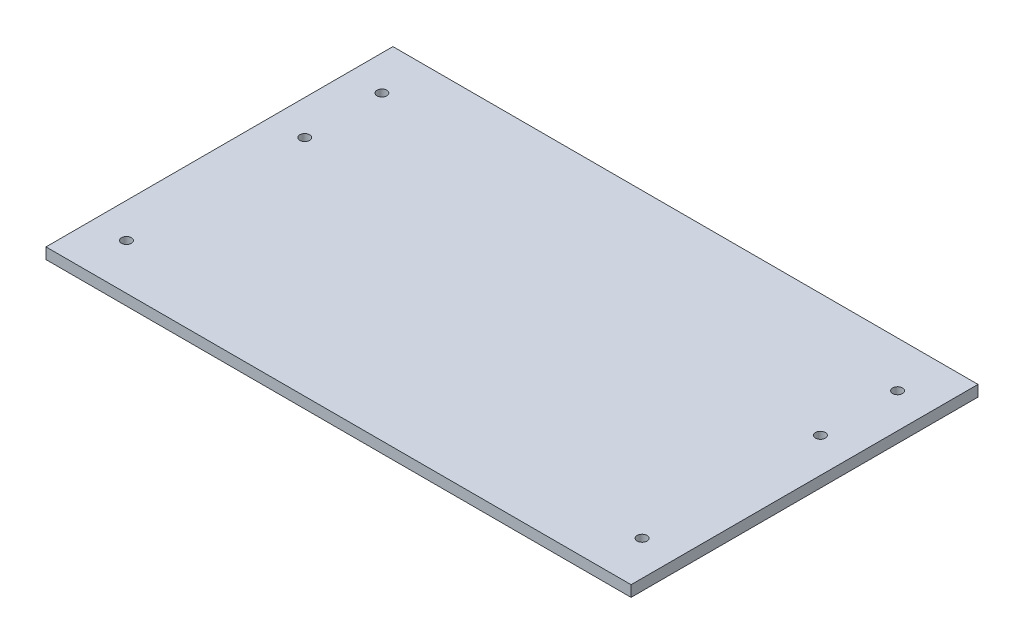
ISO-10303-21;
HEADER;
FILE_DESCRIPTION(('STEP AP214'),'2;1');
FILE_NAME('part.step','',(''),(''),'','','');
FILE_SCHEMA(('AUTOMOTIVE_DESIGN { 1 0 10303 214 1 1 1 1 }'));
ENDSEC;
DATA;
#1=APPLICATION_CONTEXT('core data for automotive mechanical design processes');
#2=APPLICATION_PROTOCOL_DEFINITION('international standard','automotive_design',2000,#1);
#3=PRODUCT_CONTEXT('',#1,'mechanical');
#4=PRODUCT('Part','Part','',(#3));
#5=PRODUCT_RELATED_PRODUCT_CATEGORY('part','',(#4));
#6=PRODUCT_DEFINITION_FORMATION('','',#4);
#7=PRODUCT_DEFINITION_CONTEXT('part definition',#1,'design');
#8=PRODUCT_DEFINITION('design','',#6,#7);
#9=PRODUCT_DEFINITION_SHAPE('','',#8);
#10=(LENGTH_UNIT() NAMED_UNIT(*) SI_UNIT(.MILLI.,.METRE.));
#11=(NAMED_UNIT(*) PLANE_ANGLE_UNIT() SI_UNIT($,.RADIAN.));
#12=(NAMED_UNIT(*) SI_UNIT($,.STERADIAN.) SOLID_ANGLE_UNIT());
#13=UNCERTAINTY_MEASURE_WITH_UNIT(LENGTH_MEASURE(1.E-05),#10,'distance_accuracy_value','');
#14=(GEOMETRIC_REPRESENTATION_CONTEXT(3) GLOBAL_UNCERTAINTY_ASSIGNED_CONTEXT((#13)) GLOBAL_UNIT_ASSIGNED_CONTEXT((#10,
#11,#12)) REPRESENTATION_CONTEXT('',''));
#15=CARTESIAN_POINT('',(0.,0.,0.));
#16=DIRECTION('',(0.,0.,1.));
#17=DIRECTION('',(1.,0.,0.));
#18=AXIS2_PLACEMENT_3D('',#15,#16,#17);
#19=CARTESIAN_POINT('',(84.325,3.18,50.));
#20=DIRECTION('',(-1.,0.,0.));
#21=DIRECTION('',(0.,0.,1.));
#22=AXIS2_PLACEMENT_3D('',#19,#20,#21);
#23=PLANE('',#22);
#24=DIRECTION('',(0.,0.,-1.));
#25=VECTOR('',#24,1.);
#26=CARTESIAN_POINT('',(84.325,0.,50.));
#27=LINE('',#26,#25);
#28=CARTESIAN_POINT('',(84.325,0.,50.));
#29=VERTEX_POINT('',#28);
#30=CARTESIAN_POINT('',(84.325,0.,-50.));
#31=VERTEX_POINT('',#30);
#32=EDGE_CURVE('E97',#29,#31,#27,.T.);
#33=ORIENTED_EDGE('',*,*,#32,.T.);
#34=DIRECTION('',(0.,-1.,0.));
#35=VECTOR('',#34,1.);
#36=CARTESIAN_POINT('',(84.325,3.18,-50.));
#37=LINE('',#36,#35);
#38=CARTESIAN_POINT('',(84.325,3.18,-50.));
#39=VERTEX_POINT('',#38);
#40=EDGE_CURVE('E11',#39,#31,#37,.T.);
#41=ORIENTED_EDGE('',*,*,#40,.F.);
#42=DIRECTION('',(0.,0.,-1.));
#43=VECTOR('',#42,1.);
#44=CARTESIAN_POINT('',(84.325,3.18,50.));
#45=LINE('',#44,#43);
#46=CARTESIAN_POINT('',(84.325,3.18,50.));
#47=VERTEX_POINT('',#46);
#48=EDGE_CURVE('E85',#47,#39,#45,.T.);
#49=ORIENTED_EDGE('',*,*,#48,.F.);
#50=DIRECTION('',(0.,-1.,0.));
#51=VECTOR('',#50,1.);
#52=CARTESIAN_POINT('',(84.325,3.18,50.));
#53=LINE('',#52,#51);
#54=EDGE_CURVE('E93',#47,#29,#53,.T.);
#55=ORIENTED_EDGE('',*,*,#54,.T.);
#56=EDGE_LOOP('',(#33,#41,#49,#55));
#57=FACE_BOUND('',#56,.T.);
#58=ADVANCED_FACE('F34',(#57),#23,.F.);
#59=CARTESIAN_POINT('',(-84.325,3.18,-50.));
#60=DIRECTION('',(0.,0.,1.));
#61=DIRECTION('',(1.,0.,0.));
#62=AXIS2_PLACEMENT_3D('',#59,#60,#61);
#63=PLANE('',#62);
#64=DIRECTION('',(-1.,0.,0.));
#65=VECTOR('',#64,1.);
#66=CARTESIAN_POINT('',(-84.325,0.,-50.));
#67=LINE('',#66,#65);
#68=CARTESIAN_POINT('',(-84.325,0.,-50.));
#69=VERTEX_POINT('',#68);
#70=EDGE_CURVE('E89',#31,#69,#67,.T.);
#71=ORIENTED_EDGE('',*,*,#70,.T.);
#72=DIRECTION('',(0.,-1.,0.));
#73=VECTOR('',#72,1.);
#74=CARTESIAN_POINT('',(-84.325,3.18,-50.));
#75=LINE('',#74,#73);
#76=CARTESIAN_POINT('',(-84.325,3.18,-50.));
#77=VERTEX_POINT('',#76);
#78=EDGE_CURVE('E42',#77,#69,#75,.T.);
#79=ORIENTED_EDGE('',*,*,#78,.F.);
#80=DIRECTION('',(-1.,0.,0.));
#81=VECTOR('',#80,1.);
#82=CARTESIAN_POINT('',(-84.325,3.18,-50.));
#83=LINE('',#82,#81);
#84=EDGE_CURVE('E80',#39,#77,#83,.T.);
#85=ORIENTED_EDGE('',*,*,#84,.F.);
#86=ORIENTED_EDGE('',*,*,#40,.T.);
#87=EDGE_LOOP('',(#71,#79,#85,#86));
#88=FACE_BOUND('',#87,.T.);
#89=ADVANCED_FACE('F88',(#88),#63,.F.);
#90=CARTESIAN_POINT('',(-84.325,3.18,50.));
#91=DIRECTION('',(1.,0.,0.));
#92=DIRECTION('',(0.,0.,-1.));
#93=AXIS2_PLACEMENT_3D('',#90,#91,#92);
#94=PLANE('',#93);
#95=DIRECTION('',(0.,0.,1.));
#96=VECTOR('',#95,1.);
#97=CARTESIAN_POINT('',(-84.325,0.,50.));
#98=LINE('',#97,#96);
#99=CARTESIAN_POINT('',(-84.325,0.,50.));
#100=VERTEX_POINT('',#99);
#101=EDGE_CURVE('E67',#69,#100,#98,.T.);
#102=ORIENTED_EDGE('',*,*,#101,.T.);
#103=DIRECTION('',(0.,-1.,0.));
#104=VECTOR('',#103,1.);
#105=CARTESIAN_POINT('',(-84.325,3.18,50.));
#106=LINE('',#105,#104);
#107=CARTESIAN_POINT('',(-84.325,3.18,50.));
#108=VERTEX_POINT('',#107);
#109=EDGE_CURVE('E90',#108,#100,#106,.T.);
#110=ORIENTED_EDGE('',*,*,#109,.F.);
#111=DIRECTION('',(0.,0.,1.));
#112=VECTOR('',#111,1.);
#113=CARTESIAN_POINT('',(-84.325,3.18,50.));
#114=LINE('',#113,#112);
#115=EDGE_CURVE('E83',#77,#108,#114,.T.);
#116=ORIENTED_EDGE('',*,*,#115,.F.);
#117=ORIENTED_EDGE('',*,*,#78,.T.);
#118=EDGE_LOOP('',(#102,#110,#116,#117));
#119=FACE_BOUND('',#118,.T.);
#120=ADVANCED_FACE('F91',(#119),#94,.F.);
#121=CARTESIAN_POINT('',(-84.325,3.18,50.));
#122=DIRECTION('',(0.,0.,-1.));
#123=DIRECTION('',(-1.,0.,0.));
#124=AXIS2_PLACEMENT_3D('',#121,#122,#123);
#125=PLANE('',#124);
#126=DIRECTION('',(1.,0.,0.));
#127=VECTOR('',#126,1.);
#128=CARTESIAN_POINT('',(-84.325,0.,50.));
#129=LINE('',#128,#127);
#130=EDGE_CURVE('E73',#100,#29,#129,.T.);
#131=ORIENTED_EDGE('',*,*,#130,.T.);
#132=ORIENTED_EDGE('',*,*,#54,.F.);
#133=DIRECTION('',(1.,0.,0.));
#134=VECTOR('',#133,1.);
#135=CARTESIAN_POINT('',(-84.325,3.18,50.));
#136=LINE('',#135,#134);
#137=EDGE_CURVE('E50',#108,#47,#136,.T.);
#138=ORIENTED_EDGE('',*,*,#137,.F.);
#139=ORIENTED_EDGE('',*,*,#109,.T.);
#140=EDGE_LOOP('',(#131,#132,#138,#139));
#141=FACE_BOUND('',#140,.T.);
#142=ADVANCED_FACE('F105',(#141),#125,.F.);
#143=CARTESIAN_POINT('',(0.,3.18,0.));
#144=DIRECTION('',(0.,-1.,0.));
#145=DIRECTION('',(0.,0.,-1.));
#146=AXIS2_PLACEMENT_3D('',#143,#144,#145);
#147=PLANE('',#146);
#148=CARTESIAN_POINT('',(-74.325,3.18,-14.58));
#149=DIRECTION('',(0.,1.,0.));
#150=DIRECTION('',(0.,0.,1.));
#151=AXIS2_PLACEMENT_3D('',#148,#149,#150);
#152=CIRCLE('',#151,1.42240000000001);
#153=CARTESIAN_POINT('',(-74.325,3.18,-13.1576));
#154=VERTEX_POINT('',#153);
#155=EDGE_CURVE('E141',#154,#154,#152,.T.);
#156=ORIENTED_EDGE('',*,*,#155,.F.);
#157=EDGE_LOOP('',(#156));
#158=FACE_BOUND('',#157,.T.);
#159=CARTESIAN_POINT('',(74.325,3.18,-14.58));
#160=DIRECTION('',(0.,1.,0.));
#161=DIRECTION('',(0.,0.,1.));
#162=AXIS2_PLACEMENT_3D('',#159,#160,#161);
#163=CIRCLE('',#162,1.42239999999999);
#164=CARTESIAN_POINT('',(74.325,3.18,-13.1576));
#165=VERTEX_POINT('',#164);
#166=EDGE_CURVE('E135',#165,#165,#163,.T.);
#167=ORIENTED_EDGE('',*,*,#166,.F.);
#168=EDGE_LOOP('',(#167));
#169=FACE_BOUND('',#168,.T.);
#170=CARTESIAN_POINT('',(-74.325,3.18,-36.82));
#171=DIRECTION('',(0.,1.,0.));
#172=DIRECTION('',(0.,0.,1.));
#173=AXIS2_PLACEMENT_3D('',#170,#171,#172);
#174=CIRCLE('',#173,1.42239999999999);
#175=CARTESIAN_POINT('',(-74.325,3.18,-38.2424));
#176=VERTEX_POINT('',#175);
#177=EDGE_CURVE('E115',#176,#176,#174,.T.);
#178=ORIENTED_EDGE('',*,*,#177,.F.);
#179=EDGE_LOOP('',(#178));
#180=FACE_BOUND('',#179,.T.);
#181=CARTESIAN_POINT('',(74.325,3.18,-36.82));
#182=DIRECTION('',(0.,1.,0.));
#183=DIRECTION('',(0.,0.,1.));
#184=AXIS2_PLACEMENT_3D('',#181,#182,#183);
#185=CIRCLE('',#184,1.42240000000001);
#186=CARTESIAN_POINT('',(74.325,3.18,-38.2424));
#187=VERTEX_POINT('',#186);
#188=EDGE_CURVE('E126',#187,#187,#185,.T.);
#189=ORIENTED_EDGE('',*,*,#188,.F.);
#190=EDGE_LOOP('',(#189));
#191=FACE_BOUND('',#190,.T.);
#192=CARTESIAN_POINT('',(-74.325,3.18,36.82));
#193=DIRECTION('',(0.,-1.,0.));
#194=DIRECTION('',(0.,0.,-1.));
#195=AXIS2_PLACEMENT_3D('',#192,#193,#194);
#196=CIRCLE('',#195,1.42239999999999);
#197=CARTESIAN_POINT('',(-74.325,3.18,35.3976));
#198=VERTEX_POINT('',#197);
#199=EDGE_CURVE('E100',#198,#198,#196,.T.);
#200=ORIENTED_EDGE('',*,*,#199,.T.);
#201=EDGE_LOOP('',(#200));
#202=FACE_BOUND('',#201,.T.);
#203=CARTESIAN_POINT('',(74.325,3.18,36.82));
#204=DIRECTION('',(0.,-1.,0.));
#205=DIRECTION('',(0.,0.,-1.));
#206=AXIS2_PLACEMENT_3D('',#203,#204,#205);
#207=CIRCLE('',#206,1.42240000000001);
#208=CARTESIAN_POINT('',(74.325,3.18,35.3976));
#209=VERTEX_POINT('',#208);
#210=EDGE_CURVE('E114',#209,#209,#207,.T.);
#211=ORIENTED_EDGE('',*,*,#210,.T.);
#212=EDGE_LOOP('',(#211));
#213=FACE_BOUND('',#212,.T.);
#214=ORIENTED_EDGE('',*,*,#48,.T.);
#215=ORIENTED_EDGE('',*,*,#84,.T.);
#216=ORIENTED_EDGE('',*,*,#115,.T.);
#217=ORIENTED_EDGE('',*,*,#137,.T.);
#218=EDGE_LOOP('',(#214,#215,#216,#217));
#219=FACE_BOUND('',#218,.T.);
#220=ADVANCED_FACE('F81',(#158,#169,#180,#191,#202,#213,#219),#147,.F.);
#221=CARTESIAN_POINT('',(0.,0.,0.));
#222=DIRECTION('',(0.,-1.,0.));
#223=DIRECTION('',(0.,0.,-1.));
#224=AXIS2_PLACEMENT_3D('',#221,#222,#223);
#225=PLANE('',#224);
#226=CARTESIAN_POINT('',(-74.325,0.,-14.58));
#227=DIRECTION('',(0.,1.,0.));
#228=DIRECTION('',(0.,0.,1.));
#229=AXIS2_PLACEMENT_3D('',#226,#227,#228);
#230=CIRCLE('',#229,1.42240000000001);
#231=CARTESIAN_POINT('',(-74.325,0.,-13.1576));
#232=VERTEX_POINT('',#231);
#233=EDGE_CURVE('E127',#232,#232,#230,.T.);
#234=ORIENTED_EDGE('',*,*,#233,.T.);
#235=EDGE_LOOP('',(#234));
#236=FACE_BOUND('',#235,.T.);
#237=CARTESIAN_POINT('',(74.325,0.,-14.58));
#238=DIRECTION('',(0.,1.,0.));
#239=DIRECTION('',(0.,0.,1.));
#240=AXIS2_PLACEMENT_3D('',#237,#238,#239);
#241=CIRCLE('',#240,1.42239999999999);
#242=CARTESIAN_POINT('',(74.325,0.,-13.1576));
#243=VERTEX_POINT('',#242);
#244=EDGE_CURVE('E138',#243,#243,#241,.T.);
#245=ORIENTED_EDGE('',*,*,#244,.T.);
#246=EDGE_LOOP('',(#245));
#247=FACE_BOUND('',#246,.T.);
#248=CARTESIAN_POINT('',(-74.325,0.,-36.82));
#249=DIRECTION('',(0.,1.,0.));
#250=DIRECTION('',(0.,0.,1.));
#251=AXIS2_PLACEMENT_3D('',#248,#249,#250);
#252=CIRCLE('',#251,1.42239999999999);
#253=CARTESIAN_POINT('',(-74.325,0.,-38.2424));
#254=VERTEX_POINT('',#253);
#255=EDGE_CURVE('E130',#254,#254,#252,.T.);
#256=ORIENTED_EDGE('',*,*,#255,.T.);
#257=EDGE_LOOP('',(#256));
#258=FACE_BOUND('',#257,.T.);
#259=CARTESIAN_POINT('',(74.325,0.,-36.82));
#260=DIRECTION('',(0.,1.,0.));
#261=DIRECTION('',(0.,0.,1.));
#262=AXIS2_PLACEMENT_3D('',#259,#260,#261);
#263=CIRCLE('',#262,1.42240000000001);
#264=CARTESIAN_POINT('',(74.325,0.,-38.2424));
#265=VERTEX_POINT('',#264);
#266=EDGE_CURVE('E123',#265,#265,#263,.T.);
#267=ORIENTED_EDGE('',*,*,#266,.T.);
#268=EDGE_LOOP('',(#267));
#269=FACE_BOUND('',#268,.T.);
#270=CARTESIAN_POINT('',(-74.325,0.,36.82));
#271=DIRECTION('',(0.,-1.,0.));
#272=DIRECTION('',(0.,0.,-1.));
#273=AXIS2_PLACEMENT_3D('',#270,#271,#272);
#274=CIRCLE('',#273,1.42239999999999);
#275=CARTESIAN_POINT('',(-74.325,0.,35.3976));
#276=VERTEX_POINT('',#275);
#277=EDGE_CURVE('E118',#276,#276,#274,.T.);
#278=ORIENTED_EDGE('',*,*,#277,.F.);
#279=EDGE_LOOP('',(#278));
#280=FACE_BOUND('',#279,.T.);
#281=CARTESIAN_POINT('',(74.325,0.,36.82));
#282=DIRECTION('',(0.,-1.,0.));
#283=DIRECTION('',(0.,0.,-1.));
#284=AXIS2_PLACEMENT_3D('',#281,#282,#283);
#285=CIRCLE('',#284,1.42240000000001);
#286=CARTESIAN_POINT('',(74.325,0.,35.3976));
#287=VERTEX_POINT('',#286);
#288=EDGE_CURVE('E111',#287,#287,#285,.T.);
#289=ORIENTED_EDGE('',*,*,#288,.F.);
#290=EDGE_LOOP('',(#289));
#291=FACE_BOUND('',#290,.T.);
#292=ORIENTED_EDGE('',*,*,#32,.F.);
#293=ORIENTED_EDGE('',*,*,#130,.F.);
#294=ORIENTED_EDGE('',*,*,#101,.F.);
#295=ORIENTED_EDGE('',*,*,#70,.F.);
#296=EDGE_LOOP('',(#292,#293,#294,#295));
#297=FACE_BOUND('',#296,.T.);
#298=ADVANCED_FACE('F108',(#236,#247,#258,#269,#280,#291,#297),#225,.T.);
#299=CARTESIAN_POINT('',(74.325,3.18,36.82));
#300=DIRECTION('',(0.,-1.,0.));
#301=DIRECTION('',(0.,0.,-1.));
#302=AXIS2_PLACEMENT_3D('',#299,#300,#301);
#303=CYLINDRICAL_SURFACE('',#302,1.42240000000001);
#304=CARTESIAN_POINT('',(74.325,3.18,35.3976));
#305=CARTESIAN_POINT('',(74.325,3.146875,35.3976));
#306=CARTESIAN_POINT('',(74.325,3.11375,35.3976));
#307=CARTESIAN_POINT('',(74.325,3.0475,35.3976));
#308=CARTESIAN_POINT('',(74.325,3.014375,35.3976));
#309=CARTESIAN_POINT('',(74.325,2.948125,35.3976));
#310=CARTESIAN_POINT('',(74.325,2.915,35.3976));
#311=CARTESIAN_POINT('',(74.325,2.84875,35.3976));
#312=CARTESIAN_POINT('',(74.325,2.815625,35.3976));
#313=CARTESIAN_POINT('',(74.325,2.749375,35.3976));
#314=CARTESIAN_POINT('',(74.325,2.71625,35.3976));
#315=CARTESIAN_POINT('',(74.325,2.65,35.3976));
#316=CARTESIAN_POINT('',(74.325,2.616875,35.3976));
#317=CARTESIAN_POINT('',(74.325,2.550625,35.3976));
#318=CARTESIAN_POINT('',(74.325,2.5175,35.3976));
#319=CARTESIAN_POINT('',(74.325,2.45125,35.3976));
#320=CARTESIAN_POINT('',(74.325,2.418125,35.3976));
#321=CARTESIAN_POINT('',(74.325,2.351875,35.3976));
#322=CARTESIAN_POINT('',(74.325,2.31875,35.3976));
#323=CARTESIAN_POINT('',(74.325,2.2525,35.3976));
#324=CARTESIAN_POINT('',(74.325,2.219375,35.3976));
#325=CARTESIAN_POINT('',(74.325,2.153125,35.3976));
#326=CARTESIAN_POINT('',(74.325,2.12,35.3976));
#327=CARTESIAN_POINT('',(74.325,2.05375,35.3976));
#328=CARTESIAN_POINT('',(74.325,2.020625,35.3976));
#329=CARTESIAN_POINT('',(74.325,1.954375,35.3976));
#330=CARTESIAN_POINT('',(74.325,1.92125,35.3976));
#331=CARTESIAN_POINT('',(74.325,1.855,35.3976));
#332=CARTESIAN_POINT('',(74.325,1.821875,35.3976));
#333=CARTESIAN_POINT('',(74.325,1.755625,35.3976));
#334=CARTESIAN_POINT('',(74.325,1.7225,35.3976));
#335=CARTESIAN_POINT('',(74.325,1.65625,35.3976));
#336=CARTESIAN_POINT('',(74.325,1.623125,35.3976));
#337=CARTESIAN_POINT('',(74.325,1.556875,35.3976));
#338=CARTESIAN_POINT('',(74.325,1.52375,35.3976));
#339=CARTESIAN_POINT('',(74.325,1.4575,35.3976));
#340=CARTESIAN_POINT('',(74.325,1.424375,35.3976));
#341=CARTESIAN_POINT('',(74.325,1.358125,35.3976));
#342=CARTESIAN_POINT('',(74.325,1.325,35.3976));
#343=CARTESIAN_POINT('',(74.325,1.25875,35.3976));
#344=CARTESIAN_POINT('',(74.325,1.225625,35.3976));
#345=CARTESIAN_POINT('',(74.325,1.159375,35.3976));
#346=CARTESIAN_POINT('',(74.325,1.12625,35.3976));
#347=CARTESIAN_POINT('',(74.325,1.06,35.3976));
#348=CARTESIAN_POINT('',(74.325,1.026875,35.3976));
#349=CARTESIAN_POINT('',(74.325,0.960625,35.3976));
#350=CARTESIAN_POINT('',(74.325,0.9275,35.3976));
#351=CARTESIAN_POINT('',(74.325,0.86125,35.3976));
#352=CARTESIAN_POINT('',(74.325,0.828125,35.3976));
#353=CARTESIAN_POINT('',(74.325,0.761875,35.3976));
#354=CARTESIAN_POINT('',(74.325,0.72875,35.3976));
#355=CARTESIAN_POINT('',(74.325,0.6625,35.3976));
#356=CARTESIAN_POINT('',(74.325,0.629375,35.3976));
#357=CARTESIAN_POINT('',(74.325,0.563125,35.3976));
#358=CARTESIAN_POINT('',(74.325,0.53,35.3976));
#359=CARTESIAN_POINT('',(74.325,0.46375,35.3976));
#360=CARTESIAN_POINT('',(74.325,0.430625,35.3976));
#361=CARTESIAN_POINT('',(74.325,0.364375,35.3976));
#362=CARTESIAN_POINT('',(74.325,0.33125,35.3976));
#363=CARTESIAN_POINT('',(74.325,0.265,35.3976));
#364=CARTESIAN_POINT('',(74.325,0.231875,35.3976));
#365=CARTESIAN_POINT('',(74.325,0.165625,35.3976));
#366=CARTESIAN_POINT('',(74.325,0.1325,35.3976));
#367=CARTESIAN_POINT('',(74.325,0.06625,35.3976));
#368=CARTESIAN_POINT('',(74.325,0.033125,35.3976));
#369=CARTESIAN_POINT('',(74.325,0.,35.3976));
#370=B_SPLINE_CURVE_WITH_KNOTS('',3,(#304,#305,#306,#307,#308,#309,#310,#311,#312,#313,#314,
#315,#316,#317,#318,#319,#320,#321,#322,#323,#324,#325,#326,#327,#328,#329,#330,#331,#332,#333,
#334,#335,#336,#337,#338,#339,#340,#341,#342,#343,#344,#345,#346,#347,#348,#349,#350,#351,#352,
#353,#354,#355,#356,#357,#358,#359,#360,#361,#362,#363,#364,#365,#366,#367,#368,#369),
.UNSPECIFIED.,.F.,.F.,(4,2,2,2,2,2,2,2,2,2,2,2,2,2,2,2,2,2,2,2,2,2,2,2,2,2,2,2,2,2,2,2,4),(0.,
0.0993750000000001,0.19875,0.298125,0.3975,0.496875,0.59625,0.695625,0.795000000000001,0.894375,
0.99375,1.093125,1.1925,1.291875,1.39125,1.490625,1.59,1.689375,1.78875,1.888125,1.9875,
2.086875,2.18625,2.285625,2.385,2.484375,2.58375,2.683125,2.7825,2.881875,2.98125,3.080625,
3.18),.UNSPECIFIED.);
#371=EDGE_CURVE('BSEAM169',#209,#287,#370,.T.);
#372=ORIENTED_EDGE('',*,*,#210,.F.);
#373=ORIENTED_EDGE('',*,*,#288,.T.);
#374=ORIENTED_EDGE('',*,*,#371,.T.);
#375=ORIENTED_EDGE('',*,*,#371,.F.);
#376=EDGE_LOOP('',(#372,#374,#373,#375));
#377=FACE_BOUND('',#376,.T.);
#378=ADVANCED_FACE('F169',(#377),#303,.F.);
#379=CARTESIAN_POINT('',(-74.325,3.18,36.82));
#380=DIRECTION('',(0.,-1.,0.));
#381=DIRECTION('',(0.,0.,-1.));
#382=AXIS2_PLACEMENT_3D('',#379,#380,#381);
#383=CYLINDRICAL_SURFACE('',#382,1.42239999999999);
#384=CARTESIAN_POINT('',(-74.325,3.18,35.3976));
#385=CARTESIAN_POINT('',(-74.325,3.146875,35.3976));
#386=CARTESIAN_POINT('',(-74.325,3.11375,35.3976));
#387=CARTESIAN_POINT('',(-74.325,3.0475,35.3976));
#388=CARTESIAN_POINT('',(-74.325,3.014375,35.3976));
#389=CARTESIAN_POINT('',(-74.325,2.948125,35.3976));
#390=CARTESIAN_POINT('',(-74.325,2.915,35.3976));
#391=CARTESIAN_POINT('',(-74.325,2.84875,35.3976));
#392=CARTESIAN_POINT('',(-74.325,2.815625,35.3976));
#393=CARTESIAN_POINT('',(-74.325,2.749375,35.3976));
#394=CARTESIAN_POINT('',(-74.325,2.71625,35.3976));
#395=CARTESIAN_POINT('',(-74.325,2.65,35.3976));
#396=CARTESIAN_POINT('',(-74.325,2.616875,35.3976));
#397=CARTESIAN_POINT('',(-74.325,2.550625,35.3976));
#398=CARTESIAN_POINT('',(-74.325,2.5175,35.3976));
#399=CARTESIAN_POINT('',(-74.325,2.45125,35.3976));
#400=CARTESIAN_POINT('',(-74.325,2.418125,35.3976));
#401=CARTESIAN_POINT('',(-74.325,2.351875,35.3976));
#402=CARTESIAN_POINT('',(-74.325,2.31875,35.3976));
#403=CARTESIAN_POINT('',(-74.325,2.2525,35.3976));
#404=CARTESIAN_POINT('',(-74.325,2.219375,35.3976));
#405=CARTESIAN_POINT('',(-74.325,2.153125,35.3976));
#406=CARTESIAN_POINT('',(-74.325,2.12,35.3976));
#407=CARTESIAN_POINT('',(-74.325,2.05375,35.3976));
#408=CARTESIAN_POINT('',(-74.325,2.020625,35.3976));
#409=CARTESIAN_POINT('',(-74.325,1.954375,35.3976));
#410=CARTESIAN_POINT('',(-74.325,1.92125,35.3976));
#411=CARTESIAN_POINT('',(-74.325,1.855,35.3976));
#412=CARTESIAN_POINT('',(-74.325,1.821875,35.3976));
#413=CARTESIAN_POINT('',(-74.325,1.755625,35.3976));
#414=CARTESIAN_POINT('',(-74.325,1.7225,35.3976));
#415=CARTESIAN_POINT('',(-74.325,1.65625,35.3976));
#416=CARTESIAN_POINT('',(-74.325,1.623125,35.3976));
#417=CARTESIAN_POINT('',(-74.325,1.556875,35.3976));
#418=CARTESIAN_POINT('',(-74.325,1.52375,35.3976));
#419=CARTESIAN_POINT('',(-74.325,1.4575,35.3976));
#420=CARTESIAN_POINT('',(-74.325,1.424375,35.3976));
#421=CARTESIAN_POINT('',(-74.325,1.358125,35.3976));
#422=CARTESIAN_POINT('',(-74.325,1.325,35.3976));
#423=CARTESIAN_POINT('',(-74.325,1.25875,35.3976));
#424=CARTESIAN_POINT('',(-74.325,1.225625,35.3976));
#425=CARTESIAN_POINT('',(-74.325,1.159375,35.3976));
#426=CARTESIAN_POINT('',(-74.325,1.12625,35.3976));
#427=CARTESIAN_POINT('',(-74.325,1.06,35.3976));
#428=CARTESIAN_POINT('',(-74.325,1.026875,35.3976));
#429=CARTESIAN_POINT('',(-74.325,0.960625,35.3976));
#430=CARTESIAN_POINT('',(-74.325,0.9275,35.3976));
#431=CARTESIAN_POINT('',(-74.325,0.86125,35.3976));
#432=CARTESIAN_POINT('',(-74.325,0.828125,35.3976));
#433=CARTESIAN_POINT('',(-74.325,0.761875,35.3976));
#434=CARTESIAN_POINT('',(-74.325,0.72875,35.3976));
#435=CARTESIAN_POINT('',(-74.325,0.6625,35.3976));
#436=CARTESIAN_POINT('',(-74.325,0.629375,35.3976));
#437=CARTESIAN_POINT('',(-74.325,0.563125,35.3976));
#438=CARTESIAN_POINT('',(-74.325,0.53,35.3976));
#439=CARTESIAN_POINT('',(-74.325,0.46375,35.3976));
#440=CARTESIAN_POINT('',(-74.325,0.430625,35.3976));
#441=CARTESIAN_POINT('',(-74.325,0.364375,35.3976));
#442=CARTESIAN_POINT('',(-74.325,0.33125,35.3976));
#443=CARTESIAN_POINT('',(-74.325,0.265,35.3976));
#444=CARTESIAN_POINT('',(-74.325,0.231875,35.3976));
#445=CARTESIAN_POINT('',(-74.325,0.165625,35.3976));
#446=CARTESIAN_POINT('',(-74.325,0.1325,35.3976));
#447=CARTESIAN_POINT('',(-74.325,0.06625,35.3976));
#448=CARTESIAN_POINT('',(-74.325,0.033125,35.3976));
#449=CARTESIAN_POINT('',(-74.325,0.,35.3976));
#450=B_SPLINE_CURVE_WITH_KNOTS('',3,(#384,#385,#386,#387,#388,#389,#390,#391,#392,#393,#394,
#395,#396,#397,#398,#399,#400,#401,#402,#403,#404,#405,#406,#407,#408,#409,#410,#411,#412,#413,
#414,#415,#416,#417,#418,#419,#420,#421,#422,#423,#424,#425,#426,#427,#428,#429,#430,#431,#432,
#433,#434,#435,#436,#437,#438,#439,#440,#441,#442,#443,#444,#445,#446,#447,#448,#449),
.UNSPECIFIED.,.F.,.F.,(4,2,2,2,2,2,2,2,2,2,2,2,2,2,2,2,2,2,2,2,2,2,2,2,2,2,2,2,2,2,2,2,4),(0.,
0.0993750000000001,0.19875,0.298125,0.3975,0.496875,0.59625,0.695625,0.795000000000001,0.894375,
0.99375,1.093125,1.1925,1.291875,1.39125,1.490625,1.59,1.689375,1.78875,1.888125,1.9875,
2.086875,2.18625,2.285625,2.385,2.484375,2.58375,2.683125,2.7825,2.881875,2.98125,3.080625,
3.18),.UNSPECIFIED.);
#451=EDGE_CURVE('BSEAM172',#198,#276,#450,.T.);
#452=ORIENTED_EDGE('',*,*,#199,.F.);
#453=ORIENTED_EDGE('',*,*,#277,.T.);
#454=ORIENTED_EDGE('',*,*,#451,.T.);
#455=ORIENTED_EDGE('',*,*,#451,.F.);
#456=EDGE_LOOP('',(#452,#454,#453,#455));
#457=FACE_BOUND('',#456,.T.);
#458=ADVANCED_FACE('F172',(#457),#383,.F.);
#459=CARTESIAN_POINT('',(74.325,3.18,-36.82));
#460=DIRECTION('',(0.,-1.,0.));
#461=DIRECTION('',(0.,0.,-1.));
#462=AXIS2_PLACEMENT_3D('',#459,#460,#461);
#463=CYLINDRICAL_SURFACE('',#462,1.42240000000001);
#464=CARTESIAN_POINT('',(74.325,3.18,-38.2424));
#465=CARTESIAN_POINT('',(74.325,3.146875,-38.2424));
#466=CARTESIAN_POINT('',(74.325,3.11375,-38.2424));
#467=CARTESIAN_POINT('',(74.325,3.0475,-38.2424));
#468=CARTESIAN_POINT('',(74.325,3.014375,-38.2424));
#469=CARTESIAN_POINT('',(74.325,2.948125,-38.2424));
#470=CARTESIAN_POINT('',(74.325,2.915,-38.2424));
#471=CARTESIAN_POINT('',(74.325,2.84875,-38.2424));
#472=CARTESIAN_POINT('',(74.325,2.815625,-38.2424));
#473=CARTESIAN_POINT('',(74.325,2.749375,-38.2424));
#474=CARTESIAN_POINT('',(74.325,2.71625,-38.2424));
#475=CARTESIAN_POINT('',(74.325,2.65,-38.2424));
#476=CARTESIAN_POINT('',(74.325,2.616875,-38.2424));
#477=CARTESIAN_POINT('',(74.325,2.550625,-38.2424));
#478=CARTESIAN_POINT('',(74.325,2.5175,-38.2424));
#479=CARTESIAN_POINT('',(74.325,2.45125,-38.2424));
#480=CARTESIAN_POINT('',(74.325,2.418125,-38.2424));
#481=CARTESIAN_POINT('',(74.325,2.351875,-38.2424));
#482=CARTESIAN_POINT('',(74.325,2.31875,-38.2424));
#483=CARTESIAN_POINT('',(74.325,2.2525,-38.2424));
#484=CARTESIAN_POINT('',(74.325,2.219375,-38.2424));
#485=CARTESIAN_POINT('',(74.325,2.153125,-38.2424));
#486=CARTESIAN_POINT('',(74.325,2.12,-38.2424));
#487=CARTESIAN_POINT('',(74.325,2.05375,-38.2424));
#488=CARTESIAN_POINT('',(74.325,2.020625,-38.2424));
#489=CARTESIAN_POINT('',(74.325,1.954375,-38.2424));
#490=CARTESIAN_POINT('',(74.325,1.92125,-38.2424));
#491=CARTESIAN_POINT('',(74.325,1.855,-38.2424));
#492=CARTESIAN_POINT('',(74.325,1.821875,-38.2424));
#493=CARTESIAN_POINT('',(74.325,1.755625,-38.2424));
#494=CARTESIAN_POINT('',(74.325,1.7225,-38.2424));
#495=CARTESIAN_POINT('',(74.325,1.65625,-38.2424));
#496=CARTESIAN_POINT('',(74.325,1.623125,-38.2424));
#497=CARTESIAN_POINT('',(74.325,1.556875,-38.2424));
#498=CARTESIAN_POINT('',(74.325,1.52375,-38.2424));
#499=CARTESIAN_POINT('',(74.325,1.4575,-38.2424));
#500=CARTESIAN_POINT('',(74.325,1.424375,-38.2424));
#501=CARTESIAN_POINT('',(74.325,1.358125,-38.2424));
#502=CARTESIAN_POINT('',(74.325,1.325,-38.2424));
#503=CARTESIAN_POINT('',(74.325,1.25875,-38.2424));
#504=CARTESIAN_POINT('',(74.325,1.225625,-38.2424));
#505=CARTESIAN_POINT('',(74.325,1.159375,-38.2424));
#506=CARTESIAN_POINT('',(74.325,1.12625,-38.2424));
#507=CARTESIAN_POINT('',(74.325,1.06,-38.2424));
#508=CARTESIAN_POINT('',(74.325,1.026875,-38.2424));
#509=CARTESIAN_POINT('',(74.325,0.960625,-38.2424));
#510=CARTESIAN_POINT('',(74.325,0.9275,-38.2424));
#511=CARTESIAN_POINT('',(74.325,0.86125,-38.2424));
#512=CARTESIAN_POINT('',(74.325,0.828125,-38.2424));
#513=CARTESIAN_POINT('',(74.325,0.761875,-38.2424));
#514=CARTESIAN_POINT('',(74.325,0.72875,-38.2424));
#515=CARTESIAN_POINT('',(74.325,0.6625,-38.2424));
#516=CARTESIAN_POINT('',(74.325,0.629375,-38.2424));
#517=CARTESIAN_POINT('',(74.325,0.563125,-38.2424));
#518=CARTESIAN_POINT('',(74.325,0.53,-38.2424));
#519=CARTESIAN_POINT('',(74.325,0.46375,-38.2424));
#520=CARTESIAN_POINT('',(74.325,0.430625,-38.2424));
#521=CARTESIAN_POINT('',(74.325,0.364375,-38.2424));
#522=CARTESIAN_POINT('',(74.325,0.33125,-38.2424));
#523=CARTESIAN_POINT('',(74.325,0.265,-38.2424));
#524=CARTESIAN_POINT('',(74.325,0.231875,-38.2424));
#525=CARTESIAN_POINT('',(74.325,0.165625,-38.2424));
#526=CARTESIAN_POINT('',(74.325,0.1325,-38.2424));
#527=CARTESIAN_POINT('',(74.325,0.06625,-38.2424));
#528=CARTESIAN_POINT('',(74.325,0.033125,-38.2424));
#529=CARTESIAN_POINT('',(74.325,0.,-38.2424));
#530=B_SPLINE_CURVE_WITH_KNOTS('',3,(#464,#465,#466,#467,#468,#469,#470,#471,#472,#473,#474,
#475,#476,#477,#478,#479,#480,#481,#482,#483,#484,#485,#486,#487,#488,#489,#490,#491,#492,#493,
#494,#495,#496,#497,#498,#499,#500,#501,#502,#503,#504,#505,#506,#507,#508,#509,#510,#511,#512,
#513,#514,#515,#516,#517,#518,#519,#520,#521,#522,#523,#524,#525,#526,#527,#528,#529),
.UNSPECIFIED.,.F.,.F.,(4,2,2,2,2,2,2,2,2,2,2,2,2,2,2,2,2,2,2,2,2,2,2,2,2,2,2,2,2,2,2,2,4),(0.,
0.0993749999999996,0.19875,0.298125,0.3975,0.496875,0.59625,0.695625,0.795,0.894375,0.99375,
1.093125,1.1925,1.291875,1.39125,1.490625,1.59,1.689375,1.78875,1.888125,1.9875,2.086875,
2.18625,2.285625,2.385,2.484375,2.58375,2.683125,2.7825,2.881875,2.98125,3.080625,3.18),.UNSPECIFIED.);
#531=EDGE_CURVE('BSEAM231',#187,#265,#530,.T.);
#532=ORIENTED_EDGE('',*,*,#188,.T.);
#533=ORIENTED_EDGE('',*,*,#266,.F.);
#534=ORIENTED_EDGE('',*,*,#531,.T.);
#535=ORIENTED_EDGE('',*,*,#531,.F.);
#536=EDGE_LOOP('',(#532,#534,#533,#535));
#537=FACE_BOUND('',#536,.T.);
#538=ADVANCED_FACE('F231',(#537),#463,.F.);
#539=CARTESIAN_POINT('',(-74.325,3.18,-36.82));
#540=DIRECTION('',(0.,-1.,0.));
#541=DIRECTION('',(0.,0.,-1.));
#542=AXIS2_PLACEMENT_3D('',#539,#540,#541);
#543=CYLINDRICAL_SURFACE('',#542,1.42239999999999);
#544=CARTESIAN_POINT('',(-74.325,3.18,-38.2424));
#545=CARTESIAN_POINT('',(-74.325,3.146875,-38.2424));
#546=CARTESIAN_POINT('',(-74.325,3.11375,-38.2424));
#547=CARTESIAN_POINT('',(-74.325,3.0475,-38.2424));
#548=CARTESIAN_POINT('',(-74.325,3.014375,-38.2424));
#549=CARTESIAN_POINT('',(-74.325,2.948125,-38.2424));
#550=CARTESIAN_POINT('',(-74.325,2.915,-38.2424));
#551=CARTESIAN_POINT('',(-74.325,2.84875,-38.2424));
#552=CARTESIAN_POINT('',(-74.325,2.815625,-38.2424));
#553=CARTESIAN_POINT('',(-74.325,2.749375,-38.2424));
#554=CARTESIAN_POINT('',(-74.325,2.71625,-38.2424));
#555=CARTESIAN_POINT('',(-74.325,2.65,-38.2424));
#556=CARTESIAN_POINT('',(-74.325,2.616875,-38.2424));
#557=CARTESIAN_POINT('',(-74.325,2.550625,-38.2424));
#558=CARTESIAN_POINT('',(-74.325,2.5175,-38.2424));
#559=CARTESIAN_POINT('',(-74.325,2.45125,-38.2424));
#560=CARTESIAN_POINT('',(-74.325,2.418125,-38.2424));
#561=CARTESIAN_POINT('',(-74.325,2.351875,-38.2424));
#562=CARTESIAN_POINT('',(-74.325,2.31875,-38.2424));
#563=CARTESIAN_POINT('',(-74.325,2.2525,-38.2424));
#564=CARTESIAN_POINT('',(-74.325,2.219375,-38.2424));
#565=CARTESIAN_POINT('',(-74.325,2.153125,-38.2424));
#566=CARTESIAN_POINT('',(-74.325,2.12,-38.2424));
#567=CARTESIAN_POINT('',(-74.325,2.05375,-38.2424));
#568=CARTESIAN_POINT('',(-74.325,2.020625,-38.2424));
#569=CARTESIAN_POINT('',(-74.325,1.954375,-38.2424));
#570=CARTESIAN_POINT('',(-74.325,1.92125,-38.2424));
#571=CARTESIAN_POINT('',(-74.325,1.855,-38.2424));
#572=CARTESIAN_POINT('',(-74.325,1.821875,-38.2424));
#573=CARTESIAN_POINT('',(-74.325,1.755625,-38.2424));
#574=CARTESIAN_POINT('',(-74.325,1.7225,-38.2424));
#575=CARTESIAN_POINT('',(-74.325,1.65625,-38.2424));
#576=CARTESIAN_POINT('',(-74.325,1.623125,-38.2424));
#577=CARTESIAN_POINT('',(-74.325,1.556875,-38.2424));
#578=CARTESIAN_POINT('',(-74.325,1.52375,-38.2424));
#579=CARTESIAN_POINT('',(-74.325,1.4575,-38.2424));
#580=CARTESIAN_POINT('',(-74.325,1.424375,-38.2424));
#581=CARTESIAN_POINT('',(-74.325,1.358125,-38.2424));
#582=CARTESIAN_POINT('',(-74.325,1.325,-38.2424));
#583=CARTESIAN_POINT('',(-74.325,1.25875,-38.2424));
#584=CARTESIAN_POINT('',(-74.325,1.225625,-38.2424));
#585=CARTESIAN_POINT('',(-74.325,1.159375,-38.2424));
#586=CARTESIAN_POINT('',(-74.325,1.12625,-38.2424));
#587=CARTESIAN_POINT('',(-74.325,1.06,-38.2424));
#588=CARTESIAN_POINT('',(-74.325,1.026875,-38.2424));
#589=CARTESIAN_POINT('',(-74.325,0.960625,-38.2424));
#590=CARTESIAN_POINT('',(-74.325,0.9275,-38.2424));
#591=CARTESIAN_POINT('',(-74.325,0.86125,-38.2424));
#592=CARTESIAN_POINT('',(-74.325,0.828125,-38.2424));
#593=CARTESIAN_POINT('',(-74.325,0.761875,-38.2424));
#594=CARTESIAN_POINT('',(-74.325,0.72875,-38.2424));
#595=CARTESIAN_POINT('',(-74.325,0.6625,-38.2424));
#596=CARTESIAN_POINT('',(-74.325,0.629375,-38.2424));
#597=CARTESIAN_POINT('',(-74.325,0.563125,-38.2424));
#598=CARTESIAN_POINT('',(-74.325,0.53,-38.2424));
#599=CARTESIAN_POINT('',(-74.325,0.46375,-38.2424));
#600=CARTESIAN_POINT('',(-74.325,0.430625,-38.2424));
#601=CARTESIAN_POINT('',(-74.325,0.364375,-38.2424));
#602=CARTESIAN_POINT('',(-74.325,0.33125,-38.2424));
#603=CARTESIAN_POINT('',(-74.325,0.265,-38.2424));
#604=CARTESIAN_POINT('',(-74.325,0.231875,-38.2424));
#605=CARTESIAN_POINT('',(-74.325,0.165625,-38.2424));
#606=CARTESIAN_POINT('',(-74.325,0.1325,-38.2424));
#607=CARTESIAN_POINT('',(-74.325,0.06625,-38.2424));
#608=CARTESIAN_POINT('',(-74.325,0.033125,-38.2424));
#609=CARTESIAN_POINT('',(-74.325,0.,-38.2424));
#610=B_SPLINE_CURVE_WITH_KNOTS('',3,(#544,#545,#546,#547,#548,#549,#550,#551,#552,#553,#554,
#555,#556,#557,#558,#559,#560,#561,#562,#563,#564,#565,#566,#567,#568,#569,#570,#571,#572,#573,
#574,#575,#576,#577,#578,#579,#580,#581,#582,#583,#584,#585,#586,#587,#588,#589,#590,#591,#592,
#593,#594,#595,#596,#597,#598,#599,#600,#601,#602,#603,#604,#605,#606,#607,#608,#609),
.UNSPECIFIED.,.F.,.F.,(4,2,2,2,2,2,2,2,2,2,2,2,2,2,2,2,2,2,2,2,2,2,2,2,2,2,2,2,2,2,2,2,4),(0.,
0.0993749999999996,0.19875,0.298125,0.3975,0.496875,0.59625,0.695625,0.795,0.894375,0.99375,
1.093125,1.1925,1.291875,1.39125,1.490625,1.59,1.689375,1.78875,1.888125,1.9875,2.086875,
2.18625,2.285625,2.385,2.484375,2.58375,2.683125,2.7825,2.881875,2.98125,3.080625,3.18),.UNSPECIFIED.);
#611=EDGE_CURVE('BSEAM205',#176,#254,#610,.T.);
#612=ORIENTED_EDGE('',*,*,#177,.T.);
#613=ORIENTED_EDGE('',*,*,#255,.F.);
#614=ORIENTED_EDGE('',*,*,#611,.T.);
#615=ORIENTED_EDGE('',*,*,#611,.F.);
#616=EDGE_LOOP('',(#612,#614,#613,#615));
#617=FACE_BOUND('',#616,.T.);
#618=ADVANCED_FACE('F205',(#617),#543,.F.);
#619=CARTESIAN_POINT('',(74.325,0.,-14.58));
#620=DIRECTION('',(0.,1.,0.));
#621=DIRECTION('',(0.,0.,1.));
#622=AXIS2_PLACEMENT_3D('',#619,#620,#621);
#623=CYLINDRICAL_SURFACE('',#622,1.42239999999999);
#624=CARTESIAN_POINT('',(74.325,0.,-13.1576));
#625=CARTESIAN_POINT('',(74.325,0.033125,-13.1576));
#626=CARTESIAN_POINT('',(74.325,0.06625,-13.1576));
#627=CARTESIAN_POINT('',(74.325,0.1325,-13.1576));
#628=CARTESIAN_POINT('',(74.325,0.165625,-13.1576));
#629=CARTESIAN_POINT('',(74.325,0.231875,-13.1576));
#630=CARTESIAN_POINT('',(74.325,0.265,-13.1576));
#631=CARTESIAN_POINT('',(74.325,0.33125,-13.1576));
#632=CARTESIAN_POINT('',(74.325,0.364375,-13.1576));
#633=CARTESIAN_POINT('',(74.325,0.430625,-13.1576));
#634=CARTESIAN_POINT('',(74.325,0.46375,-13.1576));
#635=CARTESIAN_POINT('',(74.325,0.53,-13.1576));
#636=CARTESIAN_POINT('',(74.325,0.563125,-13.1576));
#637=CARTESIAN_POINT('',(74.325,0.629375,-13.1576));
#638=CARTESIAN_POINT('',(74.325,0.6625,-13.1576));
#639=CARTESIAN_POINT('',(74.325,0.72875,-13.1576));
#640=CARTESIAN_POINT('',(74.325,0.761875,-13.1576));
#641=CARTESIAN_POINT('',(74.325,0.828125,-13.1576));
#642=CARTESIAN_POINT('',(74.325,0.86125,-13.1576));
#643=CARTESIAN_POINT('',(74.325,0.9275,-13.1576));
#644=CARTESIAN_POINT('',(74.325,0.960625,-13.1576));
#645=CARTESIAN_POINT('',(74.325,1.026875,-13.1576));
#646=CARTESIAN_POINT('',(74.325,1.06,-13.1576));
#647=CARTESIAN_POINT('',(74.325,1.12625,-13.1576));
#648=CARTESIAN_POINT('',(74.325,1.159375,-13.1576));
#649=CARTESIAN_POINT('',(74.325,1.225625,-13.1576));
#650=CARTESIAN_POINT('',(74.325,1.25875,-13.1576));
#651=CARTESIAN_POINT('',(74.325,1.325,-13.1576));
#652=CARTESIAN_POINT('',(74.325,1.358125,-13.1576));
#653=CARTESIAN_POINT('',(74.325,1.424375,-13.1576));
#654=CARTESIAN_POINT('',(74.325,1.4575,-13.1576));
#655=CARTESIAN_POINT('',(74.325,1.52375,-13.1576));
#656=CARTESIAN_POINT('',(74.325,1.556875,-13.1576));
#657=CARTESIAN_POINT('',(74.325,1.623125,-13.1576));
#658=CARTESIAN_POINT('',(74.325,1.65625,-13.1576));
#659=CARTESIAN_POINT('',(74.325,1.7225,-13.1576));
#660=CARTESIAN_POINT('',(74.325,1.755625,-13.1576));
#661=CARTESIAN_POINT('',(74.325,1.821875,-13.1576));
#662=CARTESIAN_POINT('',(74.325,1.855,-13.1576));
#663=CARTESIAN_POINT('',(74.325,1.92125,-13.1576));
#664=CARTESIAN_POINT('',(74.325,1.954375,-13.1576));
#665=CARTESIAN_POINT('',(74.325,2.020625,-13.1576));
#666=CARTESIAN_POINT('',(74.325,2.05375,-13.1576));
#667=CARTESIAN_POINT('',(74.325,2.12,-13.1576));
#668=CARTESIAN_POINT('',(74.325,2.153125,-13.1576));
#669=CARTESIAN_POINT('',(74.325,2.219375,-13.1576));
#670=CARTESIAN_POINT('',(74.325,2.2525,-13.1576));
#671=CARTESIAN_POINT('',(74.325,2.31875,-13.1576));
#672=CARTESIAN_POINT('',(74.325,2.351875,-13.1576));
#673=CARTESIAN_POINT('',(74.325,2.418125,-13.1576));
#674=CARTESIAN_POINT('',(74.325,2.45125,-13.1576));
#675=CARTESIAN_POINT('',(74.325,2.5175,-13.1576));
#676=CARTESIAN_POINT('',(74.325,2.550625,-13.1576));
#677=CARTESIAN_POINT('',(74.325,2.616875,-13.1576));
#678=CARTESIAN_POINT('',(74.325,2.65,-13.1576));
#679=CARTESIAN_POINT('',(74.325,2.71625,-13.1576));
#680=CARTESIAN_POINT('',(74.325,2.749375,-13.1576));
#681=CARTESIAN_POINT('',(74.325,2.815625,-13.1576));
#682=CARTESIAN_POINT('',(74.325,2.84875,-13.1576));
#683=CARTESIAN_POINT('',(74.325,2.915,-13.1576));
#684=CARTESIAN_POINT('',(74.325,2.948125,-13.1576));
#685=CARTESIAN_POINT('',(74.325,3.014375,-13.1576));
#686=CARTESIAN_POINT('',(74.325,3.0475,-13.1576));
#687=CARTESIAN_POINT('',(74.325,3.11375,-13.1576));
#688=CARTESIAN_POINT('',(74.325,3.146875,-13.1576));
#689=CARTESIAN_POINT('',(74.325,3.18,-13.1576));
#690=B_SPLINE_CURVE_WITH_KNOTS('',3,(#624,#625,#626,#627,#628,#629,#630,#631,#632,#633,#634,
#635,#636,#637,#638,#639,#640,#641,#642,#643,#644,#645,#646,#647,#648,#649,#650,#651,#652,#653,
#654,#655,#656,#657,#658,#659,#660,#661,#662,#663,#664,#665,#666,#667,#668,#669,#670,#671,#672,
#673,#674,#675,#676,#677,#678,#679,#680,#681,#682,#683,#684,#685,#686,#687,#688,#689),
.UNSPECIFIED.,.F.,.F.,(4,2,2,2,2,2,2,2,2,2,2,2,2,2,2,2,2,2,2,2,2,2,2,2,2,2,2,2,2,2,2,2,4),(0.,
0.099375,0.19875,0.298125,0.3975,0.496875,0.59625,0.695625,0.795,0.894375,0.99375,1.093125,
1.1925,1.291875,1.39125,1.490625,1.59,1.689375,1.78875,1.888125,1.9875,2.086875,2.18625,
2.285625,2.385,2.484375,2.58375,2.683125,2.7825,2.881875,2.98125,3.080625,3.18),.UNSPECIFIED.);
#691=EDGE_CURVE('BSEAM152',#243,#165,#690,.T.);
#692=ORIENTED_EDGE('',*,*,#244,.F.);
#693=ORIENTED_EDGE('',*,*,#166,.T.);
#694=ORIENTED_EDGE('',*,*,#691,.T.);
#695=ORIENTED_EDGE('',*,*,#691,.F.);
#696=EDGE_LOOP('',(#692,#694,#693,#695));
#697=FACE_BOUND('',#696,.T.);
#698=ADVANCED_FACE('F152',(#697),#623,.F.);
#699=CARTESIAN_POINT('',(-74.325,0.,-14.58));
#700=DIRECTION('',(0.,1.,0.));
#701=DIRECTION('',(0.,0.,1.));
#702=AXIS2_PLACEMENT_3D('',#699,#700,#701);
#703=CYLINDRICAL_SURFACE('',#702,1.42240000000001);
#704=CARTESIAN_POINT('',(-74.325,0.,-13.1576));
#705=CARTESIAN_POINT('',(-74.325,0.033125,-13.1576));
#706=CARTESIAN_POINT('',(-74.325,0.06625,-13.1576));
#707=CARTESIAN_POINT('',(-74.325,0.1325,-13.1576));
#708=CARTESIAN_POINT('',(-74.325,0.165625,-13.1576));
#709=CARTESIAN_POINT('',(-74.325,0.231875,-13.1576));
#710=CARTESIAN_POINT('',(-74.325,0.265,-13.1576));
#711=CARTESIAN_POINT('',(-74.325,0.33125,-13.1576));
#712=CARTESIAN_POINT('',(-74.325,0.364375,-13.1576));
#713=CARTESIAN_POINT('',(-74.325,0.430625,-13.1576));
#714=CARTESIAN_POINT('',(-74.325,0.46375,-13.1576));
#715=CARTESIAN_POINT('',(-74.325,0.53,-13.1576));
#716=CARTESIAN_POINT('',(-74.325,0.563125,-13.1576));
#717=CARTESIAN_POINT('',(-74.325,0.629375,-13.1576));
#718=CARTESIAN_POINT('',(-74.325,0.6625,-13.1576));
#719=CARTESIAN_POINT('',(-74.325,0.72875,-13.1576));
#720=CARTESIAN_POINT('',(-74.325,0.761875,-13.1576));
#721=CARTESIAN_POINT('',(-74.325,0.828125,-13.1576));
#722=CARTESIAN_POINT('',(-74.325,0.86125,-13.1576));
#723=CARTESIAN_POINT('',(-74.325,0.9275,-13.1576));
#724=CARTESIAN_POINT('',(-74.325,0.960625,-13.1576));
#725=CARTESIAN_POINT('',(-74.325,1.026875,-13.1576));
#726=CARTESIAN_POINT('',(-74.325,1.06,-13.1576));
#727=CARTESIAN_POINT('',(-74.325,1.12625,-13.1576));
#728=CARTESIAN_POINT('',(-74.325,1.159375,-13.1576));
#729=CARTESIAN_POINT('',(-74.325,1.225625,-13.1576));
#730=CARTESIAN_POINT('',(-74.325,1.25875,-13.1576));
#731=CARTESIAN_POINT('',(-74.325,1.325,-13.1576));
#732=CARTESIAN_POINT('',(-74.325,1.358125,-13.1576));
#733=CARTESIAN_POINT('',(-74.325,1.424375,-13.1576));
#734=CARTESIAN_POINT('',(-74.325,1.4575,-13.1576));
#735=CARTESIAN_POINT('',(-74.325,1.52375,-13.1576));
#736=CARTESIAN_POINT('',(-74.325,1.556875,-13.1576));
#737=CARTESIAN_POINT('',(-74.325,1.623125,-13.1576));
#738=CARTESIAN_POINT('',(-74.325,1.65625,-13.1576));
#739=CARTESIAN_POINT('',(-74.325,1.7225,-13.1576));
#740=CARTESIAN_POINT('',(-74.325,1.755625,-13.1576));
#741=CARTESIAN_POINT('',(-74.325,1.821875,-13.1576));
#742=CARTESIAN_POINT('',(-74.325,1.855,-13.1576));
#743=CARTESIAN_POINT('',(-74.325,1.92125,-13.1576));
#744=CARTESIAN_POINT('',(-74.325,1.954375,-13.1576));
#745=CARTESIAN_POINT('',(-74.325,2.020625,-13.1576));
#746=CARTESIAN_POINT('',(-74.325,2.05375,-13.1576));
#747=CARTESIAN_POINT('',(-74.325,2.12,-13.1576));
#748=CARTESIAN_POINT('',(-74.325,2.153125,-13.1576));
#749=CARTESIAN_POINT('',(-74.325,2.219375,-13.1576));
#750=CARTESIAN_POINT('',(-74.325,2.2525,-13.1576));
#751=CARTESIAN_POINT('',(-74.325,2.31875,-13.1576));
#752=CARTESIAN_POINT('',(-74.325,2.351875,-13.1576));
#753=CARTESIAN_POINT('',(-74.325,2.418125,-13.1576));
#754=CARTESIAN_POINT('',(-74.325,2.45125,-13.1576));
#755=CARTESIAN_POINT('',(-74.325,2.5175,-13.1576));
#756=CARTESIAN_POINT('',(-74.325,2.550625,-13.1576));
#757=CARTESIAN_POINT('',(-74.325,2.616875,-13.1576));
#758=CARTESIAN_POINT('',(-74.325,2.65,-13.1576));
#759=CARTESIAN_POINT('',(-74.325,2.71625,-13.1576));
#760=CARTESIAN_POINT('',(-74.325,2.749375,-13.1576));
#761=CARTESIAN_POINT('',(-74.325,2.815625,-13.1576));
#762=CARTESIAN_POINT('',(-74.325,2.84875,-13.1576));
#763=CARTESIAN_POINT('',(-74.325,2.915,-13.1576));
#764=CARTESIAN_POINT('',(-74.325,2.948125,-13.1576));
#765=CARTESIAN_POINT('',(-74.325,3.014375,-13.1576));
#766=CARTESIAN_POINT('',(-74.325,3.0475,-13.1576));
#767=CARTESIAN_POINT('',(-74.325,3.11375,-13.1576));
#768=CARTESIAN_POINT('',(-74.325,3.146875,-13.1576));
#769=CARTESIAN_POINT('',(-74.325,3.18,-13.1576));
#770=B_SPLINE_CURVE_WITH_KNOTS('',3,(#704,#705,#706,#707,#708,#709,#710,#711,#712,#713,#714,
#715,#716,#717,#718,#719,#720,#721,#722,#723,#724,#725,#726,#727,#728,#729,#730,#731,#732,#733,
#734,#735,#736,#737,#738,#739,#740,#741,#742,#743,#744,#745,#746,#747,#748,#749,#750,#751,#752,
#753,#754,#755,#756,#757,#758,#759,#760,#761,#762,#763,#764,#765,#766,#767,#768,#769),
.UNSPECIFIED.,.F.,.F.,(4,2,2,2,2,2,2,2,2,2,2,2,2,2,2,2,2,2,2,2,2,2,2,2,2,2,2,2,2,2,2,2,4),(0.,
0.099375,0.19875,0.298125,0.3975,0.496875,0.59625,0.695625,0.795,0.894375,0.99375,1.093125,
1.1925,1.291875,1.39125,1.490625,1.59,1.689375,1.78875,1.888125,1.9875,2.086875,2.18625,
2.285625,2.385,2.484375,2.58375,2.683125,2.7825,2.881875,2.98125,3.080625,3.18),.UNSPECIFIED.);
#771=EDGE_CURVE('BSEAM149',#232,#154,#770,.T.);
#772=ORIENTED_EDGE('',*,*,#233,.F.);
#773=ORIENTED_EDGE('',*,*,#155,.T.);
#774=ORIENTED_EDGE('',*,*,#771,.T.);
#775=ORIENTED_EDGE('',*,*,#771,.F.);
#776=EDGE_LOOP('',(#772,#774,#773,#775));
#777=FACE_BOUND('',#776,.T.);
#778=ADVANCED_FACE('F149',(#777),#703,.F.);
#779=CLOSED_SHELL('',(#58,#89,#120,#142,#220,#298,#378,#458,#538,#618,#698,#778));
#780=MANIFOLD_SOLID_BREP('B2',#779);
#781=ADVANCED_BREP_SHAPE_REPRESENTATION('',(#18,#780),#14);
#782=SHAPE_DEFINITION_REPRESENTATION(#9,#781);
ENDSEC;
END-ISO-10303-21;
